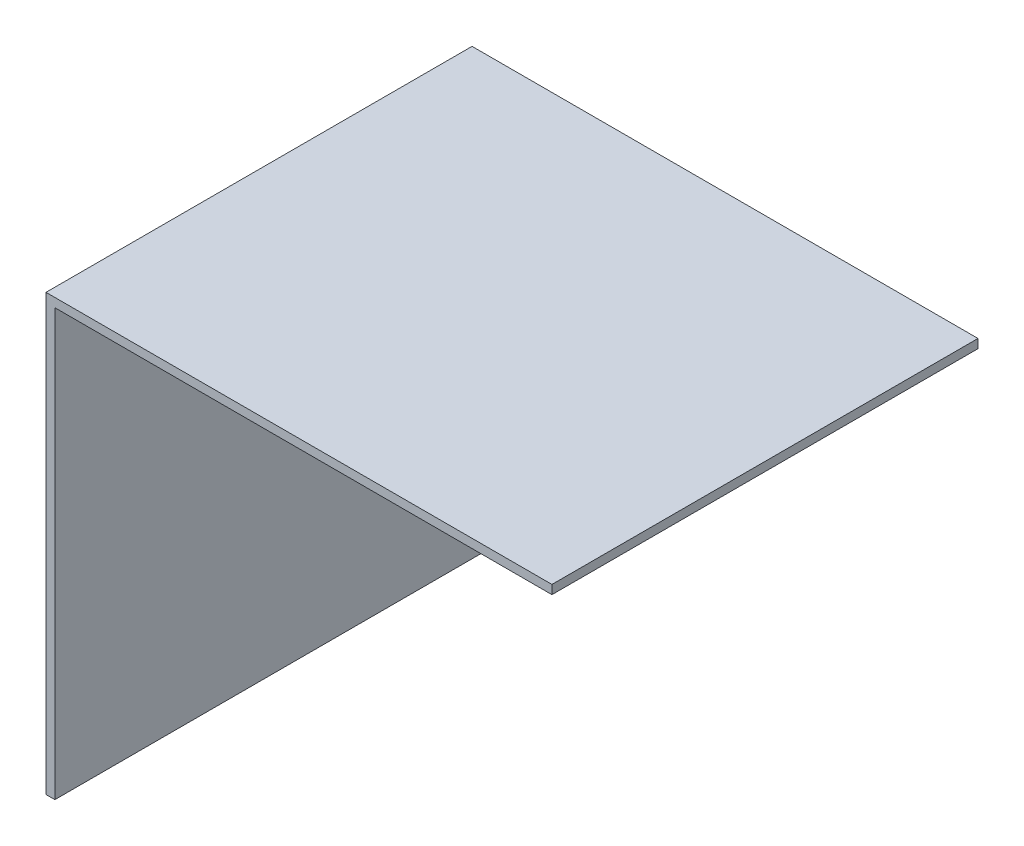
ISO-10303-21;
HEADER;
FILE_DESCRIPTION(('STEP AP214'),'2;1');
FILE_NAME('part.step','',(''),(''),'','','');
FILE_SCHEMA(('AUTOMOTIVE_DESIGN { 1 0 10303 214 1 1 1 1 }'));
ENDSEC;
DATA;
#1=APPLICATION_CONTEXT('core data for automotive mechanical design processes');
#2=APPLICATION_PROTOCOL_DEFINITION('international standard','automotive_design',2000,#1);
#3=PRODUCT_CONTEXT('',#1,'mechanical');
#4=PRODUCT('Part','Part','',(#3));
#5=PRODUCT_RELATED_PRODUCT_CATEGORY('part','',(#4));
#6=PRODUCT_DEFINITION_FORMATION('','',#4);
#7=PRODUCT_DEFINITION_CONTEXT('part definition',#1,'design');
#8=PRODUCT_DEFINITION('design','',#6,#7);
#9=PRODUCT_DEFINITION_SHAPE('','',#8);
#10=(LENGTH_UNIT() NAMED_UNIT(*) SI_UNIT(.MILLI.,.METRE.));
#11=(NAMED_UNIT(*) PLANE_ANGLE_UNIT() SI_UNIT($,.RADIAN.));
#12=(NAMED_UNIT(*) SI_UNIT($,.STERADIAN.) SOLID_ANGLE_UNIT());
#13=UNCERTAINTY_MEASURE_WITH_UNIT(LENGTH_MEASURE(1.E-05),#10,'distance_accuracy_value','');
#14=(GEOMETRIC_REPRESENTATION_CONTEXT(3) GLOBAL_UNCERTAINTY_ASSIGNED_CONTEXT((#13)) GLOBAL_UNIT_ASSIGNED_CONTEXT((#10,
#11,#12)) REPRESENTATION_CONTEXT('',''));
#15=CARTESIAN_POINT('',(0.,0.,0.));
#16=DIRECTION('',(0.,0.,1.));
#17=DIRECTION('',(1.,0.,0.));
#18=AXIS2_PLACEMENT_3D('',#15,#16,#17);
#19=CARTESIAN_POINT('',(3.17499999999999,0.,152.4));
#20=DIRECTION('',(-1.,0.,0.));
#21=DIRECTION('',(0.,-1.,0.));
#22=AXIS2_PLACEMENT_3D('',#19,#20,#21);
#23=PLANE('',#22);
#24=DIRECTION('',(0.,1.,0.));
#25=VECTOR('',#24,1.);
#26=CARTESIAN_POINT('',(3.17499999999999,0.,0.));
#27=LINE('',#26,#25);
#28=CARTESIAN_POINT('',(3.17499999999999,0.,0.));
#29=VERTEX_POINT('',#28);
#30=CARTESIAN_POINT('',(3.17499999999993,152.4,0.));
#31=VERTEX_POINT('',#30);
#32=EDGE_CURVE('E117',#29,#31,#27,.T.);
#33=ORIENTED_EDGE('',*,*,#32,.T.);
#34=DIRECTION('',(0.,0.,-1.));
#35=VECTOR('',#34,1.);
#36=CARTESIAN_POINT('',(3.17499999999993,152.4,152.4));
#37=LINE('',#36,#35);
#38=CARTESIAN_POINT('',(3.17499999999993,152.4,152.4));
#39=VERTEX_POINT('',#38);
#40=EDGE_CURVE('E11',#39,#31,#37,.T.);
#41=ORIENTED_EDGE('',*,*,#40,.F.);
#42=DIRECTION('',(0.,1.,0.));
#43=VECTOR('',#42,1.);
#44=CARTESIAN_POINT('',(3.17499999999999,0.,152.4));
#45=LINE('',#44,#43);
#46=CARTESIAN_POINT('',(3.17499999999999,0.,152.4));
#47=VERTEX_POINT('',#46);
#48=EDGE_CURVE('E129',#47,#39,#45,.T.);
#49=ORIENTED_EDGE('',*,*,#48,.F.);
#50=DIRECTION('',(0.,0.,-1.));
#51=VECTOR('',#50,1.);
#52=CARTESIAN_POINT('',(3.17499999999999,0.,152.4));
#53=LINE('',#52,#51);
#54=EDGE_CURVE('E113',#47,#29,#53,.T.);
#55=ORIENTED_EDGE('',*,*,#54,.T.);
#56=EDGE_LOOP('',(#33,#41,#49,#55));
#57=FACE_BOUND('',#56,.T.);
#58=ADVANCED_FACE('F35',(#57),#23,.F.);
#59=CARTESIAN_POINT('',(0.,152.4,152.4));
#60=DIRECTION('',(0.,1.,0.));
#61=DIRECTION('',(0.,0.,1.));
#62=AXIS2_PLACEMENT_3D('',#59,#60,#61);
#63=PLANE('',#62);
#64=DIRECTION('',(1.,0.,0.));
#65=VECTOR('',#64,1.);
#66=CARTESIAN_POINT('',(0.,152.4,0.));
#67=LINE('',#66,#65);
#68=CARTESIAN_POINT('',(180.975,152.4,0.));
#69=VERTEX_POINT('',#68);
#70=EDGE_CURVE('E120',#31,#69,#67,.T.);
#71=ORIENTED_EDGE('',*,*,#70,.T.);
#72=DIRECTION('',(0.,0.,-1.));
#73=VECTOR('',#72,1.);
#74=CARTESIAN_POINT('',(180.975,152.4,152.4));
#75=LINE('',#74,#73);
#76=CARTESIAN_POINT('',(180.975,152.4,152.4));
#77=VERTEX_POINT('',#76);
#78=EDGE_CURVE('E43',#77,#69,#75,.T.);
#79=ORIENTED_EDGE('',*,*,#78,.F.);
#80=DIRECTION('',(1.,0.,0.));
#81=VECTOR('',#80,1.);
#82=CARTESIAN_POINT('',(0.,152.4,152.4));
#83=LINE('',#82,#81);
#84=EDGE_CURVE('E84',#39,#77,#83,.T.);
#85=ORIENTED_EDGE('',*,*,#84,.F.);
#86=ORIENTED_EDGE('',*,*,#40,.T.);
#87=EDGE_LOOP('',(#71,#79,#85,#86));
#88=FACE_BOUND('',#87,.T.);
#89=ADVANCED_FACE('F153',(#88),#63,.F.);
#90=CARTESIAN_POINT('',(180.975,0.,152.4));
#91=DIRECTION('',(-1.,0.,0.));
#92=DIRECTION('',(0.,0.,1.));
#93=AXIS2_PLACEMENT_3D('',#90,#91,#92);
#94=PLANE('',#93);
#95=DIRECTION('',(0.,1.,0.));
#96=VECTOR('',#95,1.);
#97=CARTESIAN_POINT('',(180.975,0.,0.));
#98=LINE('',#97,#96);
#99=CARTESIAN_POINT('',(180.975,155.575,0.));
#100=VERTEX_POINT('',#99);
#101=EDGE_CURVE('E122',#69,#100,#98,.T.);
#102=ORIENTED_EDGE('',*,*,#101,.T.);
#103=DIRECTION('',(0.,0.,-1.));
#104=VECTOR('',#103,1.);
#105=CARTESIAN_POINT('',(180.975,155.575,152.4));
#106=LINE('',#105,#104);
#107=CARTESIAN_POINT('',(180.975,155.575,152.4));
#108=VERTEX_POINT('',#107);
#109=EDGE_CURVE('E103',#108,#100,#106,.T.);
#110=ORIENTED_EDGE('',*,*,#109,.F.);
#111=DIRECTION('',(0.,1.,0.));
#112=VECTOR('',#111,1.);
#113=CARTESIAN_POINT('',(180.975,0.,152.4));
#114=LINE('',#113,#112);
#115=EDGE_CURVE('E108',#77,#108,#114,.T.);
#116=ORIENTED_EDGE('',*,*,#115,.F.);
#117=ORIENTED_EDGE('',*,*,#78,.T.);
#118=EDGE_LOOP('',(#102,#110,#116,#117));
#119=FACE_BOUND('',#118,.T.);
#120=ADVANCED_FACE('F135',(#119),#94,.F.);
#121=CARTESIAN_POINT('',(0.,155.575,152.4));
#122=DIRECTION('',(0.,1.,0.));
#123=DIRECTION('',(0.,0.,1.));
#124=AXIS2_PLACEMENT_3D('',#121,#122,#123);
#125=PLANE('',#124);
#126=DIRECTION('',(1.,0.,0.));
#127=VECTOR('',#126,1.);
#128=CARTESIAN_POINT('',(0.,155.575,0.));
#129=LINE('',#128,#127);
#130=CARTESIAN_POINT('',(0.,155.575,0.));
#131=VERTEX_POINT('',#130);
#132=EDGE_CURVE('E98',#131,#100,#129,.T.);
#133=ORIENTED_EDGE('',*,*,#132,.F.);
#134=DIRECTION('',(0.,0.,-1.));
#135=VECTOR('',#134,1.);
#136=CARTESIAN_POINT('',(0.,155.575,152.4));
#137=LINE('',#136,#135);
#138=CARTESIAN_POINT('',(0.,155.575,152.4));
#139=VERTEX_POINT('',#138);
#140=EDGE_CURVE('E93',#139,#131,#137,.T.);
#141=ORIENTED_EDGE('',*,*,#140,.F.);
#142=DIRECTION('',(1.,0.,0.));
#143=VECTOR('',#142,1.);
#144=CARTESIAN_POINT('',(0.,155.575,152.4));
#145=LINE('',#144,#143);
#146=EDGE_CURVE('E96',#139,#108,#145,.T.);
#147=ORIENTED_EDGE('',*,*,#146,.T.);
#148=ORIENTED_EDGE('',*,*,#109,.T.);
#149=EDGE_LOOP('',(#133,#141,#147,#148));
#150=FACE_BOUND('',#149,.T.);
#151=ADVANCED_FACE('F95',(#150),#125,.T.);
#152=CARTESIAN_POINT('',(0.,0.,152.4));
#153=DIRECTION('',(-1.,0.,0.));
#154=DIRECTION('',(0.,0.,1.));
#155=AXIS2_PLACEMENT_3D('',#152,#153,#154);
#156=PLANE('',#155);
#157=DIRECTION('',(0.,1.,0.));
#158=VECTOR('',#157,1.);
#159=CARTESIAN_POINT('',(0.,0.,0.));
#160=LINE('',#159,#158);
#161=CARTESIAN_POINT('',(0.,0.,0.));
#162=VERTEX_POINT('',#161);
#163=EDGE_CURVE('E126',#162,#131,#160,.T.);
#164=ORIENTED_EDGE('',*,*,#163,.F.);
#165=DIRECTION('',(0.,0.,-1.));
#166=VECTOR('',#165,1.);
#167=CARTESIAN_POINT('',(0.,0.,152.4));
#168=LINE('',#167,#166);
#169=CARTESIAN_POINT('',(0.,0.,152.4));
#170=VERTEX_POINT('',#169);
#171=EDGE_CURVE('E73',#170,#162,#168,.T.);
#172=ORIENTED_EDGE('',*,*,#171,.F.);
#173=DIRECTION('',(0.,1.,0.));
#174=VECTOR('',#173,1.);
#175=CARTESIAN_POINT('',(0.,0.,152.4));
#176=LINE('',#175,#174);
#177=EDGE_CURVE('E106',#170,#139,#176,.T.);
#178=ORIENTED_EDGE('',*,*,#177,.T.);
#179=ORIENTED_EDGE('',*,*,#140,.T.);
#180=EDGE_LOOP('',(#164,#172,#178,#179));
#181=FACE_BOUND('',#180,.T.);
#182=ADVANCED_FACE('F111',(#181),#156,.T.);
#183=CARTESIAN_POINT('',(0.,0.,152.4));
#184=DIRECTION('',(0.,1.,0.));
#185=DIRECTION('',(0.,0.,1.));
#186=AXIS2_PLACEMENT_3D('',#183,#184,#185);
#187=PLANE('',#186);
#188=DIRECTION('',(1.,0.,0.));
#189=VECTOR('',#188,1.);
#190=CARTESIAN_POINT('',(0.,0.,0.));
#191=LINE('',#190,#189);
#192=EDGE_CURVE('E76',#162,#29,#191,.T.);
#193=ORIENTED_EDGE('',*,*,#192,.T.);
#194=ORIENTED_EDGE('',*,*,#54,.F.);
#195=DIRECTION('',(1.,0.,0.));
#196=VECTOR('',#195,1.);
#197=CARTESIAN_POINT('',(0.,0.,152.4));
#198=LINE('',#197,#196);
#199=EDGE_CURVE('E51',#170,#47,#198,.T.);
#200=ORIENTED_EDGE('',*,*,#199,.F.);
#201=ORIENTED_EDGE('',*,*,#171,.T.);
#202=EDGE_LOOP('',(#193,#194,#200,#201));
#203=FACE_BOUND('',#202,.T.);
#204=ADVANCED_FACE('F142',(#203),#187,.F.);
#205=CARTESIAN_POINT('',(0.,0.,152.4));
#206=DIRECTION('',(0.,0.,1.));
#207=DIRECTION('',(1.,0.,0.));
#208=AXIS2_PLACEMENT_3D('',#205,#206,#207);
#209=PLANE('',#208);
#210=ORIENTED_EDGE('',*,*,#48,.T.);
#211=ORIENTED_EDGE('',*,*,#84,.T.);
#212=ORIENTED_EDGE('',*,*,#115,.T.);
#213=ORIENTED_EDGE('',*,*,#146,.F.);
#214=ORIENTED_EDGE('',*,*,#177,.F.);
#215=ORIENTED_EDGE('',*,*,#199,.T.);
#216=EDGE_LOOP('',(#210,#211,#212,#213,#214,#215));
#217=FACE_BOUND('',#216,.T.);
#218=ADVANCED_FACE('F105',(#217),#209,.T.);
#219=CARTESIAN_POINT('',(0.,0.,0.));
#220=DIRECTION('',(0.,0.,1.));
#221=DIRECTION('',(1.,0.,0.));
#222=AXIS2_PLACEMENT_3D('',#219,#220,#221);
#223=PLANE('',#222);
#224=ORIENTED_EDGE('',*,*,#32,.F.);
#225=ORIENTED_EDGE('',*,*,#192,.F.);
#226=ORIENTED_EDGE('',*,*,#163,.T.);
#227=ORIENTED_EDGE('',*,*,#132,.T.);
#228=ORIENTED_EDGE('',*,*,#101,.F.);
#229=ORIENTED_EDGE('',*,*,#70,.F.);
#230=EDGE_LOOP('',(#224,#225,#226,#227,#228,#229));
#231=FACE_BOUND('',#230,.T.);
#232=ADVANCED_FACE('F138',(#231),#223,.F.);
#233=CLOSED_SHELL('',(#58,#89,#120,#151,#182,#204,#218,#232));
#234=MANIFOLD_SOLID_BREP('B2',#233);
#235=ADVANCED_BREP_SHAPE_REPRESENTATION('',(#18,#234),#14);
#236=SHAPE_DEFINITION_REPRESENTATION(#9,#235);
ENDSEC;
END-ISO-10303-21;
